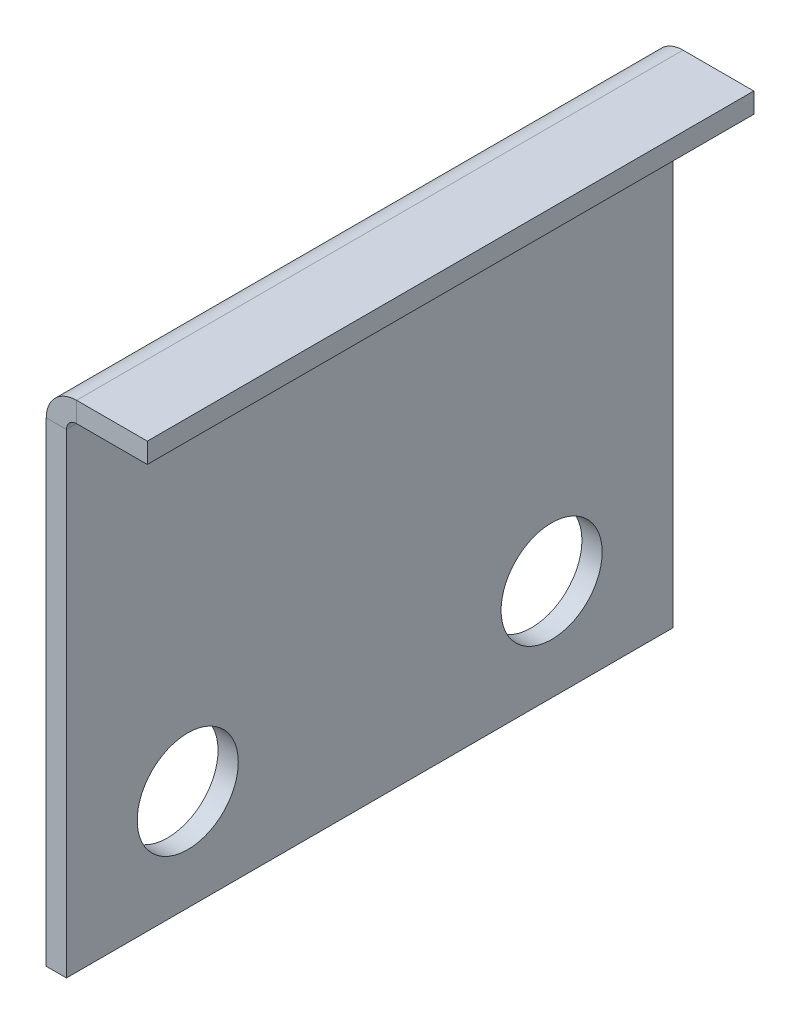
ISO-10303-21;
HEADER;
FILE_DESCRIPTION(('STEP AP214'),'2;1');
FILE_NAME('part.step','',(''),(''),'','','');
FILE_SCHEMA(('AUTOMOTIVE_DESIGN { 1 0 10303 214 1 1 1 1 }'));
ENDSEC;
DATA;
#1=APPLICATION_CONTEXT('core data for automotive mechanical design processes');
#2=APPLICATION_PROTOCOL_DEFINITION('international standard','automotive_design',2000,#1);
#3=PRODUCT_CONTEXT('',#1,'mechanical');
#4=PRODUCT('Part','Part','',(#3));
#5=PRODUCT_RELATED_PRODUCT_CATEGORY('part','',(#4));
#6=PRODUCT_DEFINITION_FORMATION('','',#4);
#7=PRODUCT_DEFINITION_CONTEXT('part definition',#1,'design');
#8=PRODUCT_DEFINITION('design','',#6,#7);
#9=PRODUCT_DEFINITION_SHAPE('','',#8);
#10=(LENGTH_UNIT() NAMED_UNIT(*) SI_UNIT(.MILLI.,.METRE.));
#11=(NAMED_UNIT(*) PLANE_ANGLE_UNIT() SI_UNIT($,.RADIAN.));
#12=(NAMED_UNIT(*) SI_UNIT($,.STERADIAN.) SOLID_ANGLE_UNIT());
#13=UNCERTAINTY_MEASURE_WITH_UNIT(LENGTH_MEASURE(1.E-05),#10,'distance_accuracy_value','');
#14=(GEOMETRIC_REPRESENTATION_CONTEXT(3) GLOBAL_UNCERTAINTY_ASSIGNED_CONTEXT((#13)) GLOBAL_UNIT_ASSIGNED_CONTEXT((#10,
#11,#12)) REPRESENTATION_CONTEXT('',''));
#15=CARTESIAN_POINT('',(0.,0.,0.));
#16=DIRECTION('',(0.,0.,1.));
#17=DIRECTION('',(1.,0.,0.));
#18=AXIS2_PLACEMENT_3D('',#15,#16,#17);
#19=CARTESIAN_POINT('',(1.5,0.,15.));
#20=DIRECTION('',(0.,0.,1.));
#21=DIRECTION('',(1.,0.,0.));
#22=AXIS2_PLACEMENT_3D('',#19,#20,#21);
#23=PLANE('',#22);
#24=DIRECTION('',(0.,-1.,0.));
#25=VECTOR('',#24,1.);
#26=CARTESIAN_POINT('',(1.5,0.,15.));
#27=LINE('',#26,#25);
#28=CARTESIAN_POINT('',(1.5,0.,15.));
#29=VERTEX_POINT('',#28);
#30=CARTESIAN_POINT('',(1.5,-1.,15.));
#31=VERTEX_POINT('',#30);
#32=EDGE_CURVE('E11',#29,#31,#27,.T.);
#33=ORIENTED_EDGE('',*,*,#32,.F.);
#34=CARTESIAN_POINT('',(1.5,-1.5,15.));
#35=DIRECTION('',(0.,0.,1.));
#36=DIRECTION('',(1.,0.,0.));
#37=AXIS2_PLACEMENT_3D('',#34,#35,#36);
#38=CIRCLE('',#37,1.5);
#39=CARTESIAN_POINT('',(0.,-1.5,15.));
#40=VERTEX_POINT('',#39);
#41=EDGE_CURVE('E131',#40,#29,#38,.F.);
#42=ORIENTED_EDGE('',*,*,#41,.F.);
#43=DIRECTION('',(-1.,0.,0.));
#44=VECTOR('',#43,1.);
#45=CARTESIAN_POINT('',(1.,-1.5,15.));
#46=LINE('',#45,#44);
#47=CARTESIAN_POINT('',(1.,-1.5,15.));
#48=VERTEX_POINT('',#47);
#49=EDGE_CURVE('E42',#48,#40,#46,.T.);
#50=ORIENTED_EDGE('',*,*,#49,.F.);
#51=CARTESIAN_POINT('',(1.5,-1.5,15.));
#52=DIRECTION('',(0.,0.,1.));
#53=DIRECTION('',(1.,0.,0.));
#54=AXIS2_PLACEMENT_3D('',#51,#52,#53);
#55=CIRCLE('',#54,0.5);
#56=EDGE_CURVE('E124',#48,#31,#55,.F.);
#57=ORIENTED_EDGE('',*,*,#56,.T.);
#58=EDGE_LOOP('',(#33,#42,#50,#57));
#59=FACE_BOUND('',#58,.T.);
#60=ADVANCED_FACE('F34',(#59),#23,.T.);
#61=CARTESIAN_POINT('',(1.,-1.5,15.));
#62=DIRECTION('',(0.,0.,1.));
#63=DIRECTION('',(1.,0.,0.));
#64=AXIS2_PLACEMENT_3D('',#61,#62,#63);
#65=PLANE('',#64);
#66=DIRECTION('',(1.,0.,0.));
#67=VECTOR('',#66,1.);
#68=CARTESIAN_POINT('',(0.,0.,15.));
#69=LINE('',#68,#67);
#70=CARTESIAN_POINT('',(5.,0.,15.));
#71=VERTEX_POINT('',#70);
#72=EDGE_CURVE('E181',#29,#71,#69,.T.);
#73=ORIENTED_EDGE('',*,*,#72,.F.);
#74=ORIENTED_EDGE('',*,*,#32,.T.);
#75=DIRECTION('',(1.,0.,0.));
#76=VECTOR('',#75,1.);
#77=CARTESIAN_POINT('',(0.,-1.,15.));
#78=LINE('',#77,#76);
#79=CARTESIAN_POINT('',(5.,-1.,15.));
#80=VERTEX_POINT('',#79);
#81=EDGE_CURVE('E90',#31,#80,#78,.T.);
#82=ORIENTED_EDGE('',*,*,#81,.T.);
#83=DIRECTION('',(0.,-1.,0.));
#84=VECTOR('',#83,1.);
#85=CARTESIAN_POINT('',(5.,0.,15.));
#86=LINE('',#85,#84);
#87=EDGE_CURVE('E377',#71,#80,#86,.T.);
#88=ORIENTED_EDGE('',*,*,#87,.F.);
#89=EDGE_LOOP('',(#73,#74,#82,#88));
#90=FACE_BOUND('',#89,.T.);
#91=ADVANCED_FACE('F189',(#90),#65,.T.);
#92=CARTESIAN_POINT('',(0.,-1.5,-15.));
#93=DIRECTION('',(0.,0.,-1.));
#94=DIRECTION('',(-1.,0.,0.));
#95=AXIS2_PLACEMENT_3D('',#92,#93,#94);
#96=PLANE('',#95);
#97=DIRECTION('',(1.,0.,0.));
#98=VECTOR('',#97,1.);
#99=CARTESIAN_POINT('',(0.,-1.5,-15.));
#100=LINE('',#99,#98);
#101=CARTESIAN_POINT('',(0.,-1.5,-15.));
#102=VERTEX_POINT('',#101);
#103=CARTESIAN_POINT('',(1.,-1.5,-15.));
#104=VERTEX_POINT('',#103);
#105=EDGE_CURVE('E77',#102,#104,#100,.T.);
#106=ORIENTED_EDGE('',*,*,#105,.F.);
#107=CARTESIAN_POINT('',(1.5,-1.5,-15.));
#108=DIRECTION('',(0.,0.,1.));
#109=DIRECTION('',(1.,0.,0.));
#110=AXIS2_PLACEMENT_3D('',#107,#108,#109);
#111=CIRCLE('',#110,1.5);
#112=CARTESIAN_POINT('',(1.5,0.,-15.));
#113=VERTEX_POINT('',#112);
#114=EDGE_CURVE('E147',#102,#113,#111,.F.);
#115=ORIENTED_EDGE('',*,*,#114,.T.);
#116=DIRECTION('',(0.,1.,0.));
#117=VECTOR('',#116,1.);
#118=CARTESIAN_POINT('',(1.5,-1.,-15.));
#119=LINE('',#118,#117);
#120=CARTESIAN_POINT('',(1.5,-1.,-15.));
#121=VERTEX_POINT('',#120);
#122=EDGE_CURVE('E84',#121,#113,#119,.T.);
#123=ORIENTED_EDGE('',*,*,#122,.F.);
#124=CARTESIAN_POINT('',(1.5,-1.5,-15.));
#125=DIRECTION('',(0.,0.,1.));
#126=DIRECTION('',(1.,0.,0.));
#127=AXIS2_PLACEMENT_3D('',#124,#125,#126);
#128=CIRCLE('',#127,0.5);
#129=EDGE_CURVE('E154',#104,#121,#128,.F.);
#130=ORIENTED_EDGE('',*,*,#129,.F.);
#131=EDGE_LOOP('',(#106,#115,#123,#130));
#132=FACE_BOUND('',#131,.T.);
#133=ADVANCED_FACE('F187',(#132),#96,.T.);
#134=CARTESIAN_POINT('',(1.5,-1.,-15.));
#135=DIRECTION('',(0.,0.,-1.));
#136=DIRECTION('',(-1.,0.,0.));
#137=AXIS2_PLACEMENT_3D('',#134,#135,#136);
#138=PLANE('',#137);
#139=DIRECTION('',(0.,1.,0.));
#140=VECTOR('',#139,1.);
#141=CARTESIAN_POINT('',(0.,-25.,-15.));
#142=LINE('',#141,#140);
#143=CARTESIAN_POINT('',(0.,-25.,-15.));
#144=VERTEX_POINT('',#143);
#145=EDGE_CURVE('E149',#144,#102,#142,.T.);
#146=ORIENTED_EDGE('',*,*,#145,.T.);
#147=ORIENTED_EDGE('',*,*,#105,.T.);
#148=DIRECTION('',(0.,1.,0.));
#149=VECTOR('',#148,1.);
#150=CARTESIAN_POINT('',(1.,-25.,-15.));
#151=LINE('',#150,#149);
#152=CARTESIAN_POINT('',(1.,-25.,-15.));
#153=VERTEX_POINT('',#152);
#154=EDGE_CURVE('E152',#153,#104,#151,.T.);
#155=ORIENTED_EDGE('',*,*,#154,.F.);
#156=DIRECTION('',(-1.,0.,0.));
#157=VECTOR('',#156,1.);
#158=CARTESIAN_POINT('',(1.,-25.,-15.));
#159=LINE('',#158,#157);
#160=EDGE_CURVE('E112',#153,#144,#159,.T.);
#161=ORIENTED_EDGE('',*,*,#160,.T.);
#162=EDGE_LOOP('',(#146,#147,#155,#161));
#163=FACE_BOUND('',#162,.T.);
#164=ADVANCED_FACE('F183',(#163),#138,.T.);
#165=CARTESIAN_POINT('',(0.,-1.,15.));
#166=DIRECTION('',(0.,1.,0.));
#167=DIRECTION('',(0.,0.,1.));
#168=AXIS2_PLACEMENT_3D('',#165,#166,#167);
#169=PLANE('',#168);
#170=DIRECTION('',(1.,0.,0.));
#171=VECTOR('',#170,1.);
#172=CARTESIAN_POINT('',(0.,-1.,-15.));
#173=LINE('',#172,#171);
#174=CARTESIAN_POINT('',(5.,-1.,-15.));
#175=VERTEX_POINT('',#174);
#176=EDGE_CURVE('E137',#121,#175,#173,.T.);
#177=ORIENTED_EDGE('',*,*,#176,.T.);
#178=DIRECTION('',(0.,0.,-1.));
#179=VECTOR('',#178,1.);
#180=CARTESIAN_POINT('',(5.,-1.,15.));
#181=LINE('',#180,#179);
#182=EDGE_CURVE('E168',#80,#175,#181,.T.);
#183=ORIENTED_EDGE('',*,*,#182,.F.);
#184=ORIENTED_EDGE('',*,*,#81,.F.);
#185=DIRECTION('',(0.,0.,-1.));
#186=VECTOR('',#185,1.);
#187=CARTESIAN_POINT('',(1.5,-1.,15.));
#188=LINE('',#187,#186);
#189=EDGE_CURVE('E136',#31,#121,#188,.T.);
#190=ORIENTED_EDGE('',*,*,#189,.T.);
#191=EDGE_LOOP('',(#177,#183,#184,#190));
#192=FACE_BOUND('',#191,.T.);
#193=ADVANCED_FACE('F195',(#192),#169,.F.);
#194=CARTESIAN_POINT('',(5.,0.,15.));
#195=DIRECTION('',(1.,0.,0.));
#196=DIRECTION('',(0.,0.,-1.));
#197=AXIS2_PLACEMENT_3D('',#194,#195,#196);
#198=PLANE('',#197);
#199=DIRECTION('',(0.,-1.,0.));
#200=VECTOR('',#199,1.);
#201=CARTESIAN_POINT('',(5.,0.,-15.));
#202=LINE('',#201,#200);
#203=CARTESIAN_POINT('',(5.,0.,-15.));
#204=VERTEX_POINT('',#203);
#205=EDGE_CURVE('E140',#204,#175,#202,.T.);
#206=ORIENTED_EDGE('',*,*,#205,.F.);
#207=DIRECTION('',(0.,0.,-1.));
#208=VECTOR('',#207,1.);
#209=CARTESIAN_POINT('',(5.,0.,15.));
#210=LINE('',#209,#208);
#211=EDGE_CURVE('E166',#71,#204,#210,.T.);
#212=ORIENTED_EDGE('',*,*,#211,.F.);
#213=ORIENTED_EDGE('',*,*,#87,.T.);
#214=ORIENTED_EDGE('',*,*,#182,.T.);
#215=EDGE_LOOP('',(#206,#212,#213,#214));
#216=FACE_BOUND('',#215,.T.);
#217=ADVANCED_FACE('F226',(#216),#198,.T.);
#218=CARTESIAN_POINT('',(0.,0.,15.));
#219=DIRECTION('',(0.,1.,0.));
#220=DIRECTION('',(0.,0.,1.));
#221=AXIS2_PLACEMENT_3D('',#218,#219,#220);
#222=PLANE('',#221);
#223=DIRECTION('',(1.,0.,0.));
#224=VECTOR('',#223,1.);
#225=CARTESIAN_POINT('',(0.,0.,-15.));
#226=LINE('',#225,#224);
#227=EDGE_CURVE('E144',#113,#204,#226,.T.);
#228=ORIENTED_EDGE('',*,*,#227,.F.);
#229=DIRECTION('',(0.,0.,-1.));
#230=VECTOR('',#229,1.);
#231=CARTESIAN_POINT('',(1.5,0.,15.));
#232=LINE('',#231,#230);
#233=EDGE_CURVE('E163',#29,#113,#232,.T.);
#234=ORIENTED_EDGE('',*,*,#233,.F.);
#235=ORIENTED_EDGE('',*,*,#72,.T.);
#236=ORIENTED_EDGE('',*,*,#211,.T.);
#237=EDGE_LOOP('',(#228,#234,#235,#236));
#238=FACE_BOUND('',#237,.T.);
#239=ADVANCED_FACE('F237',(#238),#222,.T.);
#240=CARTESIAN_POINT('',(1.5,-1.5,15.));
#241=DIRECTION('',(0.,0.,-1.));
#242=DIRECTION('',(-1.,0.,0.));
#243=AXIS2_PLACEMENT_3D('',#240,#241,#242);
#244=CYLINDRICAL_SURFACE('',#243,1.5);
#245=ORIENTED_EDGE('',*,*,#114,.F.);
#246=DIRECTION('',(0.,0.,-1.));
#247=VECTOR('',#246,1.);
#248=CARTESIAN_POINT('',(0.,-1.5,15.));
#249=LINE('',#248,#247);
#250=EDGE_CURVE('E160',#40,#102,#249,.T.);
#251=ORIENTED_EDGE('',*,*,#250,.F.);
#252=ORIENTED_EDGE('',*,*,#41,.T.);
#253=ORIENTED_EDGE('',*,*,#233,.T.);
#254=EDGE_LOOP('',(#245,#251,#252,#253));
#255=FACE_BOUND('',#254,.T.);
#256=ADVANCED_FACE('F177',(#255),#244,.T.);
#257=CARTESIAN_POINT('',(0.,-25.,15.));
#258=DIRECTION('',(-1.,0.,0.));
#259=DIRECTION('',(0.,0.,1.));
#260=AXIS2_PLACEMENT_3D('',#257,#258,#259);
#261=PLANE('',#260);
#262=CARTESIAN_POINT('',(0.,-20.,-9.));
#263=DIRECTION('',(-1.,0.,0.));
#264=DIRECTION('',(0.,0.,1.));
#265=AXIS2_PLACEMENT_3D('',#262,#263,#264);
#266=CIRCLE('',#265,2.5);
#267=CARTESIAN_POINT('',(0.,-20.,-6.5));
#268=VERTEX_POINT('',#267);
#269=EDGE_CURVE('E364',#268,#268,#266,.F.);
#270=ORIENTED_EDGE('',*,*,#269,.T.);
#271=EDGE_LOOP('',(#270));
#272=FACE_BOUND('',#271,.T.);
#273=CARTESIAN_POINT('',(0.,-20.,9.));
#274=DIRECTION('',(-1.,0.,0.));
#275=DIRECTION('',(0.,0.,1.));
#276=AXIS2_PLACEMENT_3D('',#273,#274,#275);
#277=CIRCLE('',#276,2.5);
#278=CARTESIAN_POINT('',(0.,-20.,11.5));
#279=VERTEX_POINT('',#278);
#280=EDGE_CURVE('E368',#279,#279,#277,.F.);
#281=ORIENTED_EDGE('',*,*,#280,.T.);
#282=EDGE_LOOP('',(#281));
#283=FACE_BOUND('',#282,.T.);
#284=ORIENTED_EDGE('',*,*,#145,.F.);
#285=DIRECTION('',(0.,0.,-1.));
#286=VECTOR('',#285,1.);
#287=CARTESIAN_POINT('',(0.,-25.,15.));
#288=LINE('',#287,#286);
#289=CARTESIAN_POINT('',(0.,-25.,15.));
#290=VERTEX_POINT('',#289);
#291=EDGE_CURVE('E114',#290,#144,#288,.T.);
#292=ORIENTED_EDGE('',*,*,#291,.F.);
#293=DIRECTION('',(0.,1.,0.));
#294=VECTOR('',#293,1.);
#295=CARTESIAN_POINT('',(0.,-25.,15.));
#296=LINE('',#295,#294);
#297=EDGE_CURVE('E129',#290,#40,#296,.T.);
#298=ORIENTED_EDGE('',*,*,#297,.T.);
#299=ORIENTED_EDGE('',*,*,#250,.T.);
#300=EDGE_LOOP('',(#284,#292,#298,#299));
#301=FACE_BOUND('',#300,.T.);
#302=ADVANCED_FACE('F182',(#272,#283,#301),#261,.T.);
#303=CARTESIAN_POINT('',(1.,-25.,15.));
#304=DIRECTION('',(0.,-1.,0.));
#305=DIRECTION('',(0.,0.,-1.));
#306=AXIS2_PLACEMENT_3D('',#303,#304,#305);
#307=PLANE('',#306);
#308=ORIENTED_EDGE('',*,*,#160,.F.);
#309=DIRECTION('',(0.,0.,-1.));
#310=VECTOR('',#309,1.);
#311=CARTESIAN_POINT('',(1.,-25.,15.));
#312=LINE('',#311,#310);
#313=CARTESIAN_POINT('',(1.,-25.,15.));
#314=VERTEX_POINT('',#313);
#315=EDGE_CURVE('E106',#314,#153,#312,.T.);
#316=ORIENTED_EDGE('',*,*,#315,.F.);
#317=DIRECTION('',(-1.,0.,0.));
#318=VECTOR('',#317,1.);
#319=CARTESIAN_POINT('',(1.,-25.,15.));
#320=LINE('',#319,#318);
#321=EDGE_CURVE('E110',#314,#290,#320,.T.);
#322=ORIENTED_EDGE('',*,*,#321,.T.);
#323=ORIENTED_EDGE('',*,*,#291,.T.);
#324=EDGE_LOOP('',(#308,#316,#322,#323));
#325=FACE_BOUND('',#324,.T.);
#326=ADVANCED_FACE('F108',(#325),#307,.T.);
#327=CARTESIAN_POINT('',(1.,-25.,15.));
#328=DIRECTION('',(-1.,0.,0.));
#329=DIRECTION('',(0.,0.,1.));
#330=AXIS2_PLACEMENT_3D('',#327,#328,#329);
#331=PLANE('',#330);
#332=CARTESIAN_POINT('',(1.,-20.,-9.));
#333=DIRECTION('',(1.,0.,0.));
#334=DIRECTION('',(0.,0.,-1.));
#335=AXIS2_PLACEMENT_3D('',#332,#333,#334);
#336=CIRCLE('',#335,2.5);
#337=CARTESIAN_POINT('',(1.,-20.,-11.5));
#338=VERTEX_POINT('',#337);
#339=EDGE_CURVE('E367',#338,#338,#336,.T.);
#340=ORIENTED_EDGE('',*,*,#339,.F.);
#341=EDGE_LOOP('',(#340));
#342=FACE_BOUND('',#341,.T.);
#343=CARTESIAN_POINT('',(1.,-20.,9.));
#344=DIRECTION('',(1.,0.,0.));
#345=DIRECTION('',(0.,0.,-1.));
#346=AXIS2_PLACEMENT_3D('',#343,#344,#345);
#347=CIRCLE('',#346,2.5);
#348=CARTESIAN_POINT('',(1.,-20.,6.5));
#349=VERTEX_POINT('',#348);
#350=EDGE_CURVE('E141',#349,#349,#347,.T.);
#351=ORIENTED_EDGE('',*,*,#350,.F.);
#352=EDGE_LOOP('',(#351));
#353=FACE_BOUND('',#352,.T.);
#354=ORIENTED_EDGE('',*,*,#154,.T.);
#355=DIRECTION('',(0.,0.,-1.));
#356=VECTOR('',#355,1.);
#357=CARTESIAN_POINT('',(1.,-1.5,15.));
#358=LINE('',#357,#356);
#359=EDGE_CURVE('E115',#48,#104,#358,.T.);
#360=ORIENTED_EDGE('',*,*,#359,.F.);
#361=DIRECTION('',(0.,1.,0.));
#362=VECTOR('',#361,1.);
#363=CARTESIAN_POINT('',(1.,-25.,15.));
#364=LINE('',#363,#362);
#365=EDGE_CURVE('E119',#314,#48,#364,.T.);
#366=ORIENTED_EDGE('',*,*,#365,.F.);
#367=ORIENTED_EDGE('',*,*,#315,.T.);
#368=EDGE_LOOP('',(#354,#360,#366,#367));
#369=FACE_BOUND('',#368,.T.);
#370=ADVANCED_FACE('F120',(#342,#353,#369),#331,.F.);
#371=CARTESIAN_POINT('',(1.5,-1.5,15.));
#372=DIRECTION('',(0.,0.,-1.));
#373=DIRECTION('',(-1.,0.,0.));
#374=AXIS2_PLACEMENT_3D('',#371,#372,#373);
#375=CYLINDRICAL_SURFACE('',#374,0.5);
#376=ORIENTED_EDGE('',*,*,#129,.T.);
#377=ORIENTED_EDGE('',*,*,#189,.F.);
#378=ORIENTED_EDGE('',*,*,#56,.F.);
#379=ORIENTED_EDGE('',*,*,#359,.T.);
#380=EDGE_LOOP('',(#376,#377,#378,#379));
#381=FACE_BOUND('',#380,.T.);
#382=ADVANCED_FACE('F185',(#381),#375,.F.);
#383=CARTESIAN_POINT('',(1.5,-1.5,15.));
#384=DIRECTION('',(0.,0.,1.));
#385=DIRECTION('',(1.,0.,0.));
#386=AXIS2_PLACEMENT_3D('',#383,#384,#385);
#387=PLANE('',#386);
#388=ORIENTED_EDGE('',*,*,#365,.T.);
#389=ORIENTED_EDGE('',*,*,#49,.T.);
#390=ORIENTED_EDGE('',*,*,#297,.F.);
#391=ORIENTED_EDGE('',*,*,#321,.F.);
#392=EDGE_LOOP('',(#388,#389,#390,#391));
#393=FACE_BOUND('',#392,.T.);
#394=ADVANCED_FACE('F127',(#393),#387,.T.);
#395=CARTESIAN_POINT('',(1.5,-1.5,-15.));
#396=DIRECTION('',(0.,0.,1.));
#397=DIRECTION('',(1.,0.,0.));
#398=AXIS2_PLACEMENT_3D('',#395,#396,#397);
#399=PLANE('',#398);
#400=ORIENTED_EDGE('',*,*,#176,.F.);
#401=ORIENTED_EDGE('',*,*,#122,.T.);
#402=ORIENTED_EDGE('',*,*,#227,.T.);
#403=ORIENTED_EDGE('',*,*,#205,.T.);
#404=EDGE_LOOP('',(#400,#401,#402,#403));
#405=FACE_BOUND('',#404,.T.);
#406=ADVANCED_FACE('F289',(#405),#399,.F.);
#407=CARTESIAN_POINT('',(-0.000999999999999916,-20.,9.));
#408=DIRECTION('',(1.,0.,0.));
#409=DIRECTION('',(0.,0.,-1.));
#410=AXIS2_PLACEMENT_3D('',#407,#408,#409);
#411=CYLINDRICAL_SURFACE('',#410,2.5);
#412=ORIENTED_EDGE('',*,*,#280,.F.);
#413=EDGE_LOOP('',(#412));
#414=FACE_BOUND('',#413,.T.);
#415=ORIENTED_EDGE('',*,*,#350,.T.);
#416=EDGE_LOOP('',(#415));
#417=FACE_BOUND('',#416,.T.);
#418=ADVANCED_FACE('F299',(#414,#417),#411,.F.);
#419=CARTESIAN_POINT('',(-0.000999999999999916,-20.,-9.));
#420=DIRECTION('',(1.,0.,0.));
#421=DIRECTION('',(0.,0.,-1.));
#422=AXIS2_PLACEMENT_3D('',#419,#420,#421);
#423=CYLINDRICAL_SURFACE('',#422,2.5);
#424=ORIENTED_EDGE('',*,*,#269,.F.);
#425=EDGE_LOOP('',(#424));
#426=FACE_BOUND('',#425,.T.);
#427=ORIENTED_EDGE('',*,*,#339,.T.);
#428=EDGE_LOOP('',(#427));
#429=FACE_BOUND('',#428,.T.);
#430=ADVANCED_FACE('F326',(#426,#429),#423,.F.);
#431=CLOSED_SHELL('',(#60,#91,#133,#164,#193,#217,#239,#256,#302,#326,#370,#382,#394,#406,#418,#430));
#432=MANIFOLD_SOLID_BREP('B2',#431);
#433=ADVANCED_BREP_SHAPE_REPRESENTATION('',(#18,#432),#14);
#434=SHAPE_DEFINITION_REPRESENTATION(#9,#433);
ENDSEC;
END-ISO-10303-21;
